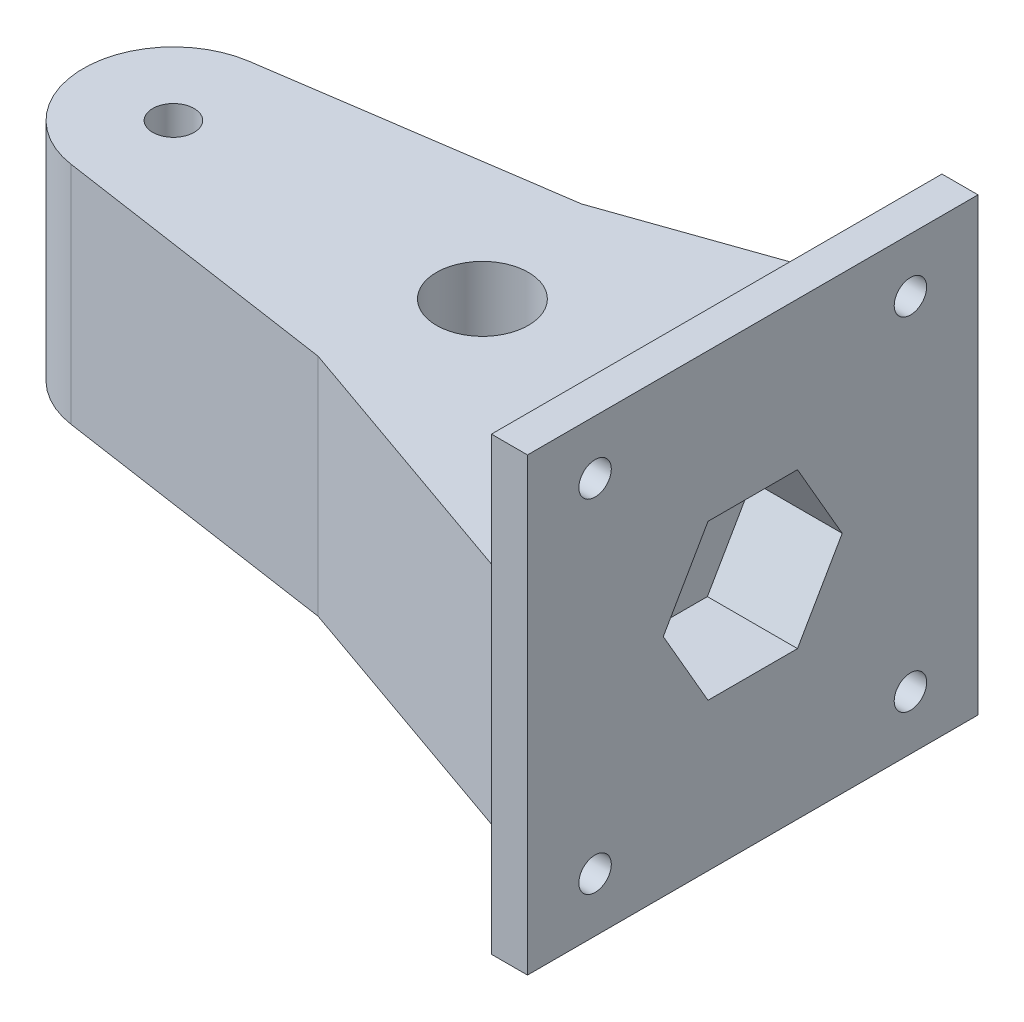
ISO-10303-21;
HEADER;
FILE_DESCRIPTION(('STEP AP214'),'2;1');
FILE_NAME('part.step','',(''),(''),'','','');
FILE_SCHEMA(('AUTOMOTIVE_DESIGN { 1 0 10303 214 1 1 1 1 }'));
ENDSEC;
DATA;
#1=APPLICATION_CONTEXT('core data for automotive mechanical design processes');
#2=APPLICATION_PROTOCOL_DEFINITION('international standard','automotive_design',2000,#1);
#3=PRODUCT_CONTEXT('',#1,'mechanical');
#4=PRODUCT('Part','Part','',(#3));
#5=PRODUCT_RELATED_PRODUCT_CATEGORY('part','',(#4));
#6=PRODUCT_DEFINITION_FORMATION('','',#4);
#7=PRODUCT_DEFINITION_CONTEXT('part definition',#1,'design');
#8=PRODUCT_DEFINITION('design','',#6,#7);
#9=PRODUCT_DEFINITION_SHAPE('','',#8);
#10=(LENGTH_UNIT() NAMED_UNIT(*) SI_UNIT(.MILLI.,.METRE.));
#11=(NAMED_UNIT(*) PLANE_ANGLE_UNIT() SI_UNIT($,.RADIAN.));
#12=(NAMED_UNIT(*) SI_UNIT($,.STERADIAN.) SOLID_ANGLE_UNIT());
#13=UNCERTAINTY_MEASURE_WITH_UNIT(LENGTH_MEASURE(1.E-05),#10,'distance_accuracy_value','');
#14=(GEOMETRIC_REPRESENTATION_CONTEXT(3) GLOBAL_UNCERTAINTY_ASSIGNED_CONTEXT((#13)) GLOBAL_UNIT_ASSIGNED_CONTEXT((#10,
#11,#12)) REPRESENTATION_CONTEXT('',''));
#15=CARTESIAN_POINT('',(0.,0.,0.));
#16=DIRECTION('',(0.,0.,1.));
#17=DIRECTION('',(1.,0.,0.));
#18=AXIS2_PLACEMENT_3D('',#15,#16,#17);
#19=CARTESIAN_POINT('',(30.,25.,-12.5));
#20=DIRECTION('',(-1.,0.,0.));
#21=DIRECTION('',(0.,0.,1.));
#22=AXIS2_PLACEMENT_3D('',#19,#20,#21);
#23=PLANE('',#22);
#24=DIRECTION('',(0.,-1.,0.));
#25=VECTOR('',#24,1.);
#26=CARTESIAN_POINT('',(30.,25.,25.));
#27=LINE('',#26,#25);
#28=CARTESIAN_POINT('',(30.,37.5,25.));
#29=VERTEX_POINT('',#28);
#30=CARTESIAN_POINT('',(30.,-12.5,25.));
#31=VERTEX_POINT('',#30);
#32=EDGE_CURVE('E147',#29,#31,#27,.T.);
#33=ORIENTED_EDGE('',*,*,#32,.T.);
#34=DIRECTION('',(0.,0.,-1.));
#35=VECTOR('',#34,1.);
#36=CARTESIAN_POINT('',(30.,-12.5,-25.));
#37=LINE('',#36,#35);
#38=CARTESIAN_POINT('',(30.,-12.5,-25.));
#39=VERTEX_POINT('',#38);
#40=EDGE_CURVE('E303',#31,#39,#37,.T.);
#41=ORIENTED_EDGE('',*,*,#40,.T.);
#42=DIRECTION('',(0.,-1.,0.));
#43=VECTOR('',#42,1.);
#44=CARTESIAN_POINT('',(30.,25.,-25.));
#45=LINE('',#44,#43);
#46=CARTESIAN_POINT('',(30.,37.5,-25.));
#47=VERTEX_POINT('',#46);
#48=EDGE_CURVE('E183',#47,#39,#45,.T.);
#49=ORIENTED_EDGE('',*,*,#48,.F.);
#50=DIRECTION('',(0.,0.,1.));
#51=VECTOR('',#50,1.);
#52=CARTESIAN_POINT('',(30.,37.5,25.));
#53=LINE('',#52,#51);
#54=EDGE_CURVE('E307',#47,#29,#53,.T.);
#55=ORIENTED_EDGE('',*,*,#54,.T.);
#56=EDGE_LOOP('',(#33,#41,#49,#55));
#57=FACE_BOUND('',#56,.T.);
#58=CARTESIAN_POINT('',(30.,31.5,17.5));
#59=DIRECTION('',(-1.,0.,0.));
#60=DIRECTION('',(0.,0.,1.));
#61=AXIS2_PLACEMENT_3D('',#58,#59,#60);
#62=CIRCLE('',#61,1.8);
#63=CARTESIAN_POINT('',(30.,31.5,19.3));
#64=VERTEX_POINT('',#63);
#65=EDGE_CURVE('E203',#64,#64,#62,.T.);
#66=ORIENTED_EDGE('',*,*,#65,.T.);
#67=EDGE_LOOP('',(#66));
#68=FACE_BOUND('',#67,.T.);
#69=CARTESIAN_POINT('',(30.,31.5,-17.5));
#70=DIRECTION('',(-1.,0.,0.));
#71=DIRECTION('',(0.,0.,1.));
#72=AXIS2_PLACEMENT_3D('',#69,#70,#71);
#73=CIRCLE('',#72,1.80000000000001);
#74=CARTESIAN_POINT('',(30.,31.5,-15.7));
#75=VERTEX_POINT('',#74);
#76=EDGE_CURVE('E208',#75,#75,#73,.T.);
#77=ORIENTED_EDGE('',*,*,#76,.T.);
#78=EDGE_LOOP('',(#77));
#79=FACE_BOUND('',#78,.T.);
#80=CARTESIAN_POINT('',(30.,-6.5,-17.5));
#81=DIRECTION('',(-1.,0.,0.));
#82=DIRECTION('',(0.,0.,1.));
#83=AXIS2_PLACEMENT_3D('',#80,#81,#82);
#84=CIRCLE('',#83,1.80000000000001);
#85=CARTESIAN_POINT('',(30.,-6.5,-15.7));
#86=VERTEX_POINT('',#85);
#87=EDGE_CURVE('E192',#86,#86,#84,.T.);
#88=ORIENTED_EDGE('',*,*,#87,.T.);
#89=EDGE_LOOP('',(#88));
#90=FACE_BOUND('',#89,.T.);
#91=CARTESIAN_POINT('',(30.,-6.5,17.5));
#92=DIRECTION('',(-1.,0.,0.));
#93=DIRECTION('',(0.,0.,1.));
#94=AXIS2_PLACEMENT_3D('',#91,#92,#93);
#95=CIRCLE('',#94,1.8);
#96=CARTESIAN_POINT('',(30.,-6.5,19.3));
#97=VERTEX_POINT('',#96);
#98=EDGE_CURVE('E198',#97,#97,#95,.T.);
#99=ORIENTED_EDGE('',*,*,#98,.T.);
#100=EDGE_LOOP('',(#99));
#101=FACE_BOUND('',#100,.T.);
#102=DIRECTION('',(0.,0.,1.));
#103=VECTOR('',#102,1.);
#104=CARTESIAN_POINT('',(30.,21.1,-12.5));
#105=LINE('',#104,#103);
#106=CARTESIAN_POINT('',(30.,21.1,-4.96521231503079));
#107=VERTEX_POINT('',#106);
#108=CARTESIAN_POINT('',(30.,21.1,4.96521231503078));
#109=VERTEX_POINT('',#108);
#110=EDGE_CURVE('E11',#107,#109,#105,.T.);
#111=ORIENTED_EDGE('',*,*,#110,.F.);
#112=DIRECTION('',(0.,0.866025403784439,0.5));
#113=VECTOR('',#112,1.);
#114=CARTESIAN_POINT('',(30.,20.7623412263473,-5.16015969889344));
#115=LINE('',#114,#113);
#116=CARTESIAN_POINT('',(30.,12.5,-9.93042463006157));
#117=VERTEX_POINT('',#116);
#118=EDGE_CURVE('E187',#117,#107,#115,.T.);
#119=ORIENTED_EDGE('',*,*,#118,.F.);
#120=DIRECTION('',(0.,0.866025403784439,-0.5));
#121=VECTOR('',#120,1.);
#122=CARTESIAN_POINT('',(30.,22.9876587736527,-15.9854772461989));
#123=LINE('',#122,#121);
#124=CARTESIAN_POINT('',(30.,3.9,-4.96521231503078));
#125=VERTEX_POINT('',#124);
#126=EDGE_CURVE('E211',#125,#117,#123,.T.);
#127=ORIENTED_EDGE('',*,*,#126,.F.);
#128=DIRECTION('',(0.,0.,-1.));
#129=VECTOR('',#128,1.);
#130=CARTESIAN_POINT('',(30.,3.9,-12.5));
#131=LINE('',#130,#129);
#132=CARTESIAN_POINT('',(30.,3.9,4.96521231503078));
#133=VERTEX_POINT('',#132);
#134=EDGE_CURVE('E214',#133,#125,#131,.T.);
#135=ORIENTED_EDGE('',*,*,#134,.F.);
#136=DIRECTION('',(0.,-0.866025403784439,-0.5));
#137=VECTOR('',#136,1.);
#138=CARTESIAN_POINT('',(30.,12.1623412263473,9.73547724619891));
#139=LINE('',#138,#137);
#140=CARTESIAN_POINT('',(30.,12.5,9.93042463006156));
#141=VERTEX_POINT('',#140);
#142=EDGE_CURVE('E218',#141,#133,#139,.T.);
#143=ORIENTED_EDGE('',*,*,#142,.F.);
#144=DIRECTION('',(0.,-0.866025403784439,0.5));
#145=VECTOR('',#144,1.);
#146=CARTESIAN_POINT('',(30.,31.5876587736527,-1.08984030110657));
#147=LINE('',#146,#145);
#148=EDGE_CURVE('E53',#109,#141,#147,.T.);
#149=ORIENTED_EDGE('',*,*,#148,.F.);
#150=EDGE_LOOP('',(#111,#119,#127,#135,#143,#149));
#151=FACE_BOUND('',#150,.T.);
#152=ADVANCED_FACE('F45',(#57,#68,#79,#90,#101,#151),#23,.F.);
#153=CARTESIAN_POINT('',(-34.3,25.,0.));
#154=DIRECTION('',(0.,1.,0.));
#155=DIRECTION('',(0.,0.,1.));
#156=AXIS2_PLACEMENT_3D('',#153,#154,#155);
#157=PLANE('',#156);
#158=CARTESIAN_POINT('',(0.,25.,0.));
#159=DIRECTION('',(0.,1.,0.));
#160=DIRECTION('',(0.,0.,1.));
#161=AXIS2_PLACEMENT_3D('',#158,#159,#160);
#162=CIRCLE('',#161,5.1);
#163=CARTESIAN_POINT('',(0.,25.,5.1));
#164=VERTEX_POINT('',#163);
#165=EDGE_CURVE('E151',#164,#164,#162,.T.);
#166=ORIENTED_EDGE('',*,*,#165,.F.);
#167=EDGE_LOOP('',(#166));
#168=FACE_BOUND('',#167,.T.);
#169=CARTESIAN_POINT('',(-34.3,25.,0.));
#170=DIRECTION('',(0.,1.,0.));
#171=DIRECTION('',(0.,0.,1.));
#172=AXIS2_PLACEMENT_3D('',#169,#170,#171);
#173=CIRCLE('',#172,2.30000000000001);
#174=CARTESIAN_POINT('',(-34.3,25.,2.30000000000001));
#175=VERTEX_POINT('',#174);
#176=EDGE_CURVE('E345',#175,#175,#173,.T.);
#177=ORIENTED_EDGE('',*,*,#176,.F.);
#178=EDGE_LOOP('',(#177));
#179=FACE_BOUND('',#178,.T.);
#180=DIRECTION('',(0.943784329190276,0.,0.33056185499065));
#181=VECTOR('',#180,1.);
#182=CARTESIAN_POINT('',(26.,25.,25.));
#183=LINE('',#182,#181);
#184=CARTESIAN_POINT('',(-3.6051533950333,25.,14.630751305289));
#185=VERTEX_POINT('',#184);
#186=CARTESIAN_POINT('',(26.,25.,25.));
#187=VERTEX_POINT('',#186);
#188=EDGE_CURVE('E141',#185,#187,#183,.T.);
#189=ORIENTED_EDGE('',*,*,#188,.T.);
#190=DIRECTION('',(0.,0.,-1.));
#191=VECTOR('',#190,1.);
#192=CARTESIAN_POINT('',(26.,25.,25.));
#193=LINE('',#192,#191);
#194=CARTESIAN_POINT('',(26.,25.,-25.));
#195=VERTEX_POINT('',#194);
#196=EDGE_CURVE('E324',#187,#195,#193,.T.);
#197=ORIENTED_EDGE('',*,*,#196,.T.);
#198=DIRECTION('',(-0.943784329190276,0.,0.33056185499065));
#199=VECTOR('',#198,1.);
#200=CARTESIAN_POINT('',(-3.60515339503332,25.,-14.630751305289));
#201=LINE('',#200,#199);
#202=CARTESIAN_POINT('',(-3.60515339503332,25.,-14.630751305289));
#203=VERTEX_POINT('',#202);
#204=EDGE_CURVE('E119',#195,#203,#201,.T.);
#205=ORIENTED_EDGE('',*,*,#204,.T.);
#206=DIRECTION('',(-0.989318124072947,0.,0.145772594752186));
#207=VECTOR('',#206,1.);
#208=CARTESIAN_POINT('',(-35.7577259475219,25.,-9.89318124072948));
#209=LINE('',#208,#207);
#210=CARTESIAN_POINT('',(-35.7577259475219,25.,-9.89318124072948));
#211=VERTEX_POINT('',#210);
#212=EDGE_CURVE('E112',#203,#211,#209,.T.);
#213=ORIENTED_EDGE('',*,*,#212,.T.);
#214=CARTESIAN_POINT('',(-34.3,25.,0.));
#215=DIRECTION('',(0.,1.,0.));
#216=DIRECTION('',(0.,0.,1.));
#217=AXIS2_PLACEMENT_3D('',#214,#215,#216);
#218=CIRCLE('',#217,10.);
#219=CARTESIAN_POINT('',(-35.7577259475219,25.,9.89318124072947));
#220=VERTEX_POINT('',#219);
#221=EDGE_CURVE('E116',#211,#220,#218,.T.);
#222=ORIENTED_EDGE('',*,*,#221,.T.);
#223=DIRECTION('',(0.989318124072947,0.,0.145772594752187));
#224=VECTOR('',#223,1.);
#225=CARTESIAN_POINT('',(-35.7577259475219,25.,9.89318124072947));
#226=LINE('',#225,#224);
#227=EDGE_CURVE('E69',#220,#185,#226,.T.);
#228=ORIENTED_EDGE('',*,*,#227,.T.);
#229=EDGE_LOOP('',(#189,#197,#205,#213,#222,#228));
#230=FACE_BOUND('',#229,.T.);
#231=ADVANCED_FACE('F114',(#168,#179,#230),#157,.T.);
#232=CARTESIAN_POINT('',(-34.3,0.,0.));
#233=DIRECTION('',(0.,1.,0.));
#234=DIRECTION('',(0.,0.,1.));
#235=AXIS2_PLACEMENT_3D('',#232,#233,#234);
#236=PLANE('',#235);
#237=DIRECTION('',(-0.943784329190276,0.,0.33056185499065));
#238=VECTOR('',#237,1.);
#239=CARTESIAN_POINT('',(-3.60515339503332,0.,-14.630751305289));
#240=LINE('',#239,#238);
#241=CARTESIAN_POINT('',(26.,0.,-25.));
#242=VERTEX_POINT('',#241);
#243=CARTESIAN_POINT('',(-3.60515339503332,0.,-14.630751305289));
#244=VERTEX_POINT('',#243);
#245=EDGE_CURVE('E148',#242,#244,#240,.T.);
#246=ORIENTED_EDGE('',*,*,#245,.F.);
#247=DIRECTION('',(0.,0.,1.));
#248=VECTOR('',#247,1.);
#249=CARTESIAN_POINT('',(26.,0.,-25.));
#250=LINE('',#249,#248);
#251=CARTESIAN_POINT('',(26.,0.,25.));
#252=VERTEX_POINT('',#251);
#253=EDGE_CURVE('E314',#242,#252,#250,.T.);
#254=ORIENTED_EDGE('',*,*,#253,.T.);
#255=DIRECTION('',(0.943784329190276,0.,0.33056185499065));
#256=VECTOR('',#255,1.);
#257=CARTESIAN_POINT('',(26.,0.,25.));
#258=LINE('',#257,#256);
#259=CARTESIAN_POINT('',(-3.6051533950333,0.,14.630751305289));
#260=VERTEX_POINT('',#259);
#261=EDGE_CURVE('E160',#260,#252,#258,.T.);
#262=ORIENTED_EDGE('',*,*,#261,.F.);
#263=DIRECTION('',(0.989318124072947,0.,0.145772594752187));
#264=VECTOR('',#263,1.);
#265=CARTESIAN_POINT('',(-35.7577259475219,0.,9.89318124072947));
#266=LINE('',#265,#264);
#267=CARTESIAN_POINT('',(-35.7577259475219,0.,9.89318124072947));
#268=VERTEX_POINT('',#267);
#269=EDGE_CURVE('E157',#268,#260,#266,.T.);
#270=ORIENTED_EDGE('',*,*,#269,.F.);
#271=CARTESIAN_POINT('',(-34.3,0.,0.));
#272=DIRECTION('',(0.,1.,0.));
#273=DIRECTION('',(0.,0.,1.));
#274=AXIS2_PLACEMENT_3D('',#271,#272,#273);
#275=CIRCLE('',#274,10.);
#276=CARTESIAN_POINT('',(-35.7577259475219,0.,-9.89318124072948));
#277=VERTEX_POINT('',#276);
#278=EDGE_CURVE('E154',#277,#268,#275,.T.);
#279=ORIENTED_EDGE('',*,*,#278,.F.);
#280=DIRECTION('',(-0.989318124072947,0.,0.145772594752186));
#281=VECTOR('',#280,1.);
#282=CARTESIAN_POINT('',(-35.7577259475219,0.,-9.89318124072948));
#283=LINE('',#282,#281);
#284=EDGE_CURVE('E129',#244,#277,#283,.T.);
#285=ORIENTED_EDGE('',*,*,#284,.F.);
#286=EDGE_LOOP('',(#246,#254,#262,#270,#279,#285));
#287=FACE_BOUND('',#286,.T.);
#288=CARTESIAN_POINT('',(0.,0.,0.));
#289=DIRECTION('',(0.,1.,0.));
#290=DIRECTION('',(0.,0.,1.));
#291=AXIS2_PLACEMENT_3D('',#288,#289,#290);
#292=CIRCLE('',#291,5.1);
#293=CARTESIAN_POINT('',(0.,0.,5.1));
#294=VERTEX_POINT('',#293);
#295=EDGE_CURVE('E349',#294,#294,#292,.T.);
#296=ORIENTED_EDGE('',*,*,#295,.T.);
#297=EDGE_LOOP('',(#296));
#298=FACE_BOUND('',#297,.T.);
#299=CARTESIAN_POINT('',(-34.3,0.,0.));
#300=DIRECTION('',(0.,1.,0.));
#301=DIRECTION('',(0.,0.,1.));
#302=AXIS2_PLACEMENT_3D('',#299,#300,#301);
#303=CIRCLE('',#302,2.30000000000001);
#304=CARTESIAN_POINT('',(-34.3,0.,2.30000000000001));
#305=VERTEX_POINT('',#304);
#306=EDGE_CURVE('E341',#305,#305,#303,.T.);
#307=ORIENTED_EDGE('',*,*,#306,.T.);
#308=EDGE_LOOP('',(#307));
#309=FACE_BOUND('',#308,.T.);
#310=ADVANCED_FACE('F361',(#287,#298,#309),#236,.F.);
#311=CARTESIAN_POINT('',(30.,25.,-25.));
#312=DIRECTION('',(0.,0.,1.));
#313=DIRECTION('',(1.,0.,0.));
#314=AXIS2_PLACEMENT_3D('',#311,#312,#313);
#315=PLANE('',#314);
#316=ORIENTED_EDGE('',*,*,#48,.T.);
#317=DIRECTION('',(1.,0.,0.));
#318=VECTOR('',#317,1.);
#319=CARTESIAN_POINT('',(26.,-12.5,-25.));
#320=LINE('',#319,#318);
#321=CARTESIAN_POINT('',(26.,-12.5,-25.));
#322=VERTEX_POINT('',#321);
#323=EDGE_CURVE('E294',#322,#39,#320,.T.);
#324=ORIENTED_EDGE('',*,*,#323,.F.);
#325=DIRECTION('',(0.,1.,0.));
#326=VECTOR('',#325,1.);
#327=CARTESIAN_POINT('',(26.,0.,-25.));
#328=LINE('',#327,#326);
#329=EDGE_CURVE('E308',#322,#242,#328,.T.);
#330=ORIENTED_EDGE('',*,*,#329,.T.);
#331=DIRECTION('',(0.,-1.,0.));
#332=VECTOR('',#331,1.);
#333=CARTESIAN_POINT('',(26.,25.,-25.));
#334=LINE('',#333,#332);
#335=EDGE_CURVE('E179',#195,#242,#334,.T.);
#336=ORIENTED_EDGE('',*,*,#335,.F.);
#337=DIRECTION('',(0.,1.,0.));
#338=VECTOR('',#337,1.);
#339=CARTESIAN_POINT('',(26.,25.,-25.));
#340=LINE('',#339,#338);
#341=CARTESIAN_POINT('',(26.,37.5,-25.));
#342=VERTEX_POINT('',#341);
#343=EDGE_CURVE('E103',#195,#342,#340,.T.);
#344=ORIENTED_EDGE('',*,*,#343,.T.);
#345=DIRECTION('',(1.,0.,0.));
#346=VECTOR('',#345,1.);
#347=CARTESIAN_POINT('',(26.,37.5,-25.));
#348=LINE('',#347,#346);
#349=EDGE_CURVE('E333',#342,#47,#348,.T.);
#350=ORIENTED_EDGE('',*,*,#349,.T.);
#351=EDGE_LOOP('',(#316,#324,#330,#336,#344,#350));
#352=FACE_BOUND('',#351,.T.);
#353=ADVANCED_FACE('F462',(#352),#315,.F.);
#354=CARTESIAN_POINT('',(-3.60515339503332,25.,-14.630751305289));
#355=DIRECTION('',(0.33056185499065,0.,0.943784329190276));
#356=DIRECTION('',(0.943784329190277,0.,-0.33056185499065));
#357=AXIS2_PLACEMENT_3D('',#354,#355,#356);
#358=PLANE('',#357);
#359=ORIENTED_EDGE('',*,*,#245,.T.);
#360=DIRECTION('',(0.,-1.,0.));
#361=VECTOR('',#360,1.);
#362=CARTESIAN_POINT('',(-3.60515339503332,25.,-14.630751305289));
#363=LINE('',#362,#361);
#364=EDGE_CURVE('E133',#203,#244,#363,.T.);
#365=ORIENTED_EDGE('',*,*,#364,.F.);
#366=ORIENTED_EDGE('',*,*,#204,.F.);
#367=ORIENTED_EDGE('',*,*,#335,.T.);
#368=EDGE_LOOP('',(#359,#365,#366,#367));
#369=FACE_BOUND('',#368,.T.);
#370=ADVANCED_FACE('F464',(#369),#358,.F.);
#371=CARTESIAN_POINT('',(-35.7577259475219,25.,-9.89318124072948));
#372=DIRECTION('',(0.145772594752186,0.,0.989318124072947));
#373=DIRECTION('',(0.989318124072947,0.,-0.145772594752186));
#374=AXIS2_PLACEMENT_3D('',#371,#372,#373);
#375=PLANE('',#374);
#376=ORIENTED_EDGE('',*,*,#284,.T.);
#377=DIRECTION('',(0.,-1.,0.));
#378=VECTOR('',#377,1.);
#379=CARTESIAN_POINT('',(-35.7577259475219,25.,-9.89318124072948));
#380=LINE('',#379,#378);
#381=EDGE_CURVE('E126',#211,#277,#380,.T.);
#382=ORIENTED_EDGE('',*,*,#381,.F.);
#383=ORIENTED_EDGE('',*,*,#212,.F.);
#384=ORIENTED_EDGE('',*,*,#364,.T.);
#385=EDGE_LOOP('',(#376,#382,#383,#384));
#386=FACE_BOUND('',#385,.T.);
#387=ADVANCED_FACE('F127',(#386),#375,.F.);
#388=CARTESIAN_POINT('',(-34.3,25.,0.));
#389=DIRECTION('',(0.,-1.,0.));
#390=DIRECTION('',(0.,0.,-1.));
#391=AXIS2_PLACEMENT_3D('',#388,#389,#390);
#392=CYLINDRICAL_SURFACE('',#391,10.);
#393=ORIENTED_EDGE('',*,*,#278,.T.);
#394=DIRECTION('',(0.,-1.,0.));
#395=VECTOR('',#394,1.);
#396=CARTESIAN_POINT('',(-35.7577259475219,25.,9.89318124072947));
#397=LINE('',#396,#395);
#398=EDGE_CURVE('E134',#220,#268,#397,.T.);
#399=ORIENTED_EDGE('',*,*,#398,.F.);
#400=ORIENTED_EDGE('',*,*,#221,.F.);
#401=ORIENTED_EDGE('',*,*,#381,.T.);
#402=EDGE_LOOP('',(#393,#399,#400,#401));
#403=FACE_BOUND('',#402,.T.);
#404=ADVANCED_FACE('F136',(#403),#392,.T.);
#405=CARTESIAN_POINT('',(-35.7577259475219,25.,9.89318124072947));
#406=DIRECTION('',(0.145772594752187,0.,-0.989318124072947));
#407=DIRECTION('',(-0.989318124072947,0.,-0.145772594752187));
#408=AXIS2_PLACEMENT_3D('',#405,#406,#407);
#409=PLANE('',#408);
#410=ORIENTED_EDGE('',*,*,#269,.T.);
#411=DIRECTION('',(0.,-1.,0.));
#412=VECTOR('',#411,1.);
#413=CARTESIAN_POINT('',(-3.6051533950333,25.,14.630751305289));
#414=LINE('',#413,#412);
#415=EDGE_CURVE('E171',#185,#260,#414,.T.);
#416=ORIENTED_EDGE('',*,*,#415,.F.);
#417=ORIENTED_EDGE('',*,*,#227,.F.);
#418=ORIENTED_EDGE('',*,*,#398,.T.);
#419=EDGE_LOOP('',(#410,#416,#417,#418));
#420=FACE_BOUND('',#419,.T.);
#421=ADVANCED_FACE('F466',(#420),#409,.F.);
#422=CARTESIAN_POINT('',(26.,25.,25.));
#423=DIRECTION('',(0.33056185499065,0.,-0.943784329190276));
#424=DIRECTION('',(-0.943784329190277,0.,-0.330561854990651));
#425=AXIS2_PLACEMENT_3D('',#422,#423,#424);
#426=PLANE('',#425);
#427=ORIENTED_EDGE('',*,*,#261,.T.);
#428=DIRECTION('',(0.,-1.,0.));
#429=VECTOR('',#428,1.);
#430=CARTESIAN_POINT('',(26.,25.,25.));
#431=LINE('',#430,#429);
#432=EDGE_CURVE('E167',#187,#252,#431,.T.);
#433=ORIENTED_EDGE('',*,*,#432,.F.);
#434=ORIENTED_EDGE('',*,*,#188,.F.);
#435=ORIENTED_EDGE('',*,*,#415,.T.);
#436=EDGE_LOOP('',(#427,#433,#434,#435));
#437=FACE_BOUND('',#436,.T.);
#438=ADVANCED_FACE('F378',(#437),#426,.F.);
#439=CARTESIAN_POINT('',(26.,25.,25.));
#440=DIRECTION('',(0.,0.,-1.));
#441=DIRECTION('',(-1.,0.,0.));
#442=AXIS2_PLACEMENT_3D('',#439,#440,#441);
#443=PLANE('',#442);
#444=ORIENTED_EDGE('',*,*,#432,.T.);
#445=DIRECTION('',(0.,-1.,0.));
#446=VECTOR('',#445,1.);
#447=CARTESIAN_POINT('',(26.,0.,25.));
#448=LINE('',#447,#446);
#449=CARTESIAN_POINT('',(26.,-12.5,25.));
#450=VERTEX_POINT('',#449);
#451=EDGE_CURVE('E94',#252,#450,#448,.T.);
#452=ORIENTED_EDGE('',*,*,#451,.T.);
#453=DIRECTION('',(1.,0.,0.));
#454=VECTOR('',#453,1.);
#455=CARTESIAN_POINT('',(26.,-12.5,25.));
#456=LINE('',#455,#454);
#457=EDGE_CURVE('E295',#450,#31,#456,.T.);
#458=ORIENTED_EDGE('',*,*,#457,.T.);
#459=ORIENTED_EDGE('',*,*,#32,.F.);
#460=DIRECTION('',(1.,0.,0.));
#461=VECTOR('',#460,1.);
#462=CARTESIAN_POINT('',(26.,37.5,25.));
#463=LINE('',#462,#461);
#464=CARTESIAN_POINT('',(26.,37.5,25.));
#465=VERTEX_POINT('',#464);
#466=EDGE_CURVE('E337',#465,#29,#463,.T.);
#467=ORIENTED_EDGE('',*,*,#466,.F.);
#468=DIRECTION('',(0.,-1.,0.));
#469=VECTOR('',#468,1.);
#470=CARTESIAN_POINT('',(26.,25.,25.));
#471=LINE('',#470,#469);
#472=EDGE_CURVE('E320',#465,#187,#471,.T.);
#473=ORIENTED_EDGE('',*,*,#472,.T.);
#474=EDGE_LOOP('',(#444,#452,#458,#459,#467,#473));
#475=FACE_BOUND('',#474,.T.);
#476=ADVANCED_FACE('F367',(#475),#443,.F.);
#477=CARTESIAN_POINT('',(0.,25.,0.));
#478=DIRECTION('',(0.,-1.,0.));
#479=DIRECTION('',(0.,0.,-1.));
#480=AXIS2_PLACEMENT_3D('',#477,#478,#479);
#481=CYLINDRICAL_SURFACE('',#480,5.1);
#482=ORIENTED_EDGE('',*,*,#165,.T.);
#483=EDGE_LOOP('',(#482));
#484=FACE_BOUND('',#483,.T.);
#485=ORIENTED_EDGE('',*,*,#295,.F.);
#486=EDGE_LOOP('',(#485));
#487=FACE_BOUND('',#486,.T.);
#488=ADVANCED_FACE('F364',(#484,#487),#481,.F.);
#489=CARTESIAN_POINT('',(-34.3,25.,0.));
#490=DIRECTION('',(0.,-1.,0.));
#491=DIRECTION('',(0.,0.,-1.));
#492=AXIS2_PLACEMENT_3D('',#489,#490,#491);
#493=CYLINDRICAL_SURFACE('',#492,2.30000000000001);
#494=ORIENTED_EDGE('',*,*,#176,.T.);
#495=EDGE_LOOP('',(#494));
#496=FACE_BOUND('',#495,.T.);
#497=ORIENTED_EDGE('',*,*,#306,.F.);
#498=EDGE_LOOP('',(#497));
#499=FACE_BOUND('',#498,.T.);
#500=ADVANCED_FACE('F366',(#496,#499),#493,.F.);
#501=CARTESIAN_POINT('',(26.,37.5,25.));
#502=DIRECTION('',(0.,1.,0.));
#503=DIRECTION('',(0.,0.,1.));
#504=AXIS2_PLACEMENT_3D('',#501,#502,#503);
#505=PLANE('',#504);
#506=ORIENTED_EDGE('',*,*,#54,.F.);
#507=ORIENTED_EDGE('',*,*,#349,.F.);
#508=DIRECTION('',(0.,0.,1.));
#509=VECTOR('',#508,1.);
#510=CARTESIAN_POINT('',(26.,37.5,25.));
#511=LINE('',#510,#509);
#512=EDGE_CURVE('E329',#342,#465,#511,.T.);
#513=ORIENTED_EDGE('',*,*,#512,.T.);
#514=ORIENTED_EDGE('',*,*,#466,.T.);
#515=EDGE_LOOP('',(#506,#507,#513,#514));
#516=FACE_BOUND('',#515,.T.);
#517=ADVANCED_FACE('F374',(#516),#505,.T.);
#518=CARTESIAN_POINT('',(26.,0.,0.));
#519=DIRECTION('',(-1.,0.,0.));
#520=DIRECTION('',(0.,0.,1.));
#521=AXIS2_PLACEMENT_3D('',#518,#519,#520);
#522=PLANE('',#521);
#523=CARTESIAN_POINT('',(26.,31.5,-17.5));
#524=DIRECTION('',(-1.,0.,0.));
#525=DIRECTION('',(0.,0.,1.));
#526=AXIS2_PLACEMENT_3D('',#523,#524,#525);
#527=CIRCLE('',#526,1.80000000000001);
#528=CARTESIAN_POINT('',(26.,31.5,-15.7));
#529=VERTEX_POINT('',#528);
#530=EDGE_CURVE('E204',#529,#529,#527,.T.);
#531=ORIENTED_EDGE('',*,*,#530,.F.);
#532=EDGE_LOOP('',(#531));
#533=FACE_BOUND('',#532,.T.);
#534=CARTESIAN_POINT('',(26.,31.5,17.5));
#535=DIRECTION('',(-1.,0.,0.));
#536=DIRECTION('',(0.,0.,1.));
#537=AXIS2_PLACEMENT_3D('',#534,#535,#536);
#538=CIRCLE('',#537,1.8);
#539=CARTESIAN_POINT('',(26.,31.5,19.3));
#540=VERTEX_POINT('',#539);
#541=EDGE_CURVE('E199',#540,#540,#538,.T.);
#542=ORIENTED_EDGE('',*,*,#541,.F.);
#543=EDGE_LOOP('',(#542));
#544=FACE_BOUND('',#543,.T.);
#545=ORIENTED_EDGE('',*,*,#472,.F.);
#546=ORIENTED_EDGE('',*,*,#512,.F.);
#547=ORIENTED_EDGE('',*,*,#343,.F.);
#548=ORIENTED_EDGE('',*,*,#196,.F.);
#549=EDGE_LOOP('',(#545,#546,#547,#548));
#550=FACE_BOUND('',#549,.T.);
#551=ADVANCED_FACE('F422',(#533,#544,#550),#522,.T.);
#552=CARTESIAN_POINT('',(26.,-12.5,-25.));
#553=DIRECTION('',(0.,-1.,0.));
#554=DIRECTION('',(0.,0.,-1.));
#555=AXIS2_PLACEMENT_3D('',#552,#553,#554);
#556=PLANE('',#555);
#557=ORIENTED_EDGE('',*,*,#40,.F.);
#558=ORIENTED_EDGE('',*,*,#457,.F.);
#559=DIRECTION('',(0.,0.,-1.));
#560=VECTOR('',#559,1.);
#561=CARTESIAN_POINT('',(26.,-12.5,-25.));
#562=LINE('',#561,#560);
#563=EDGE_CURVE('E299',#450,#322,#562,.T.);
#564=ORIENTED_EDGE('',*,*,#563,.T.);
#565=ORIENTED_EDGE('',*,*,#323,.T.);
#566=EDGE_LOOP('',(#557,#558,#564,#565));
#567=FACE_BOUND('',#566,.T.);
#568=ADVANCED_FACE('F419',(#567),#556,.T.);
#569=CARTESIAN_POINT('',(26.,0.,0.));
#570=DIRECTION('',(-1.,0.,0.));
#571=DIRECTION('',(0.,0.,1.));
#572=AXIS2_PLACEMENT_3D('',#569,#570,#571);
#573=PLANE('',#572);
#574=CARTESIAN_POINT('',(26.,-6.5,17.5));
#575=DIRECTION('',(-1.,0.,0.));
#576=DIRECTION('',(0.,0.,1.));
#577=AXIS2_PLACEMENT_3D('',#574,#575,#576);
#578=CIRCLE('',#577,1.8);
#579=CARTESIAN_POINT('',(26.,-6.5,19.3));
#580=VERTEX_POINT('',#579);
#581=EDGE_CURVE('E194',#580,#580,#578,.T.);
#582=ORIENTED_EDGE('',*,*,#581,.F.);
#583=EDGE_LOOP('',(#582));
#584=FACE_BOUND('',#583,.T.);
#585=CARTESIAN_POINT('',(26.,-6.5,-17.5));
#586=DIRECTION('',(-1.,0.,0.));
#587=DIRECTION('',(0.,0.,1.));
#588=AXIS2_PLACEMENT_3D('',#585,#586,#587);
#589=CIRCLE('',#588,1.80000000000001);
#590=CARTESIAN_POINT('',(26.,-6.5,-15.7));
#591=VERTEX_POINT('',#590);
#592=EDGE_CURVE('E188',#591,#591,#589,.T.);
#593=ORIENTED_EDGE('',*,*,#592,.F.);
#594=EDGE_LOOP('',(#593));
#595=FACE_BOUND('',#594,.T.);
#596=ORIENTED_EDGE('',*,*,#329,.F.);
#597=ORIENTED_EDGE('',*,*,#563,.F.);
#598=ORIENTED_EDGE('',*,*,#451,.F.);
#599=ORIENTED_EDGE('',*,*,#253,.F.);
#600=EDGE_LOOP('',(#596,#597,#598,#599));
#601=FACE_BOUND('',#600,.T.);
#602=ADVANCED_FACE('F414',(#584,#595,#601),#573,.T.);
#603=CARTESIAN_POINT('',(-44.3,-6.5,-17.5));
#604=DIRECTION('',(1.,0.,0.));
#605=DIRECTION('',(0.,0.,-1.));
#606=AXIS2_PLACEMENT_3D('',#603,#604,#605);
#607=CYLINDRICAL_SURFACE('',#606,1.80000000000001);
#608=ORIENTED_EDGE('',*,*,#592,.T.);
#609=EDGE_LOOP('',(#608));
#610=FACE_BOUND('',#609,.T.);
#611=ORIENTED_EDGE('',*,*,#87,.F.);
#612=EDGE_LOOP('',(#611));
#613=FACE_BOUND('',#612,.T.);
#614=ADVANCED_FACE('F404',(#610,#613),#607,.F.);
#615=CARTESIAN_POINT('',(-44.3,-6.5,17.5));
#616=DIRECTION('',(1.,0.,0.));
#617=DIRECTION('',(0.,0.,-1.));
#618=AXIS2_PLACEMENT_3D('',#615,#616,#617);
#619=CYLINDRICAL_SURFACE('',#618,1.8);
#620=ORIENTED_EDGE('',*,*,#581,.T.);
#621=EDGE_LOOP('',(#620));
#622=FACE_BOUND('',#621,.T.);
#623=ORIENTED_EDGE('',*,*,#98,.F.);
#624=EDGE_LOOP('',(#623));
#625=FACE_BOUND('',#624,.T.);
#626=ADVANCED_FACE('F401',(#622,#625),#619,.F.);
#627=CARTESIAN_POINT('',(-44.3,31.5,17.5));
#628=DIRECTION('',(1.,0.,0.));
#629=DIRECTION('',(0.,0.,-1.));
#630=AXIS2_PLACEMENT_3D('',#627,#628,#629);
#631=CYLINDRICAL_SURFACE('',#630,1.8);
#632=ORIENTED_EDGE('',*,*,#541,.T.);
#633=EDGE_LOOP('',(#632));
#634=FACE_BOUND('',#633,.T.);
#635=ORIENTED_EDGE('',*,*,#65,.F.);
#636=EDGE_LOOP('',(#635));
#637=FACE_BOUND('',#636,.T.);
#638=ADVANCED_FACE('F403',(#634,#637),#631,.F.);
#639=CARTESIAN_POINT('',(-44.3,31.5,-17.5));
#640=DIRECTION('',(1.,0.,0.));
#641=DIRECTION('',(0.,0.,-1.));
#642=AXIS2_PLACEMENT_3D('',#639,#640,#641);
#643=CYLINDRICAL_SURFACE('',#642,1.80000000000001);
#644=ORIENTED_EDGE('',*,*,#530,.T.);
#645=EDGE_LOOP('',(#644));
#646=FACE_BOUND('',#645,.T.);
#647=ORIENTED_EDGE('',*,*,#76,.F.);
#648=EDGE_LOOP('',(#647));
#649=FACE_BOUND('',#648,.T.);
#650=ADVANCED_FACE('F411',(#646,#649),#643,.F.);
#651=CARTESIAN_POINT('',(30.000012,21.1,-4.96521231503079));
#652=DIRECTION('',(0.,-1.,0.));
#653=DIRECTION('',(0.,0.,-1.));
#654=AXIS2_PLACEMENT_3D('',#651,#652,#653);
#655=PLANE('',#654);
#656=ORIENTED_EDGE('',*,*,#110,.T.);
#657=DIRECTION('',(-1.,0.,0.));
#658=VECTOR('',#657,1.);
#659=CARTESIAN_POINT('',(30.000012,21.1,4.96521231503078));
#660=LINE('',#659,#658);
#661=CARTESIAN_POINT('',(20.,21.1,4.96521231503078));
#662=VERTEX_POINT('',#661);
#663=EDGE_CURVE('E193',#109,#662,#660,.T.);
#664=ORIENTED_EDGE('',*,*,#663,.T.);
#665=DIRECTION('',(0.,0.,1.));
#666=VECTOR('',#665,1.);
#667=CARTESIAN_POINT('',(20.,21.1,-4.96521231503079));
#668=LINE('',#667,#666);
#669=CARTESIAN_POINT('',(20.,21.1,-4.96521231503079));
#670=VERTEX_POINT('',#669);
#671=EDGE_CURVE('E650',#670,#662,#668,.T.);
#672=ORIENTED_EDGE('',*,*,#671,.F.);
#673=DIRECTION('',(-1.,0.,0.));
#674=VECTOR('',#673,1.);
#675=CARTESIAN_POINT('',(30.000012,21.1,-4.96521231503079));
#676=LINE('',#675,#674);
#677=EDGE_CURVE('E276',#107,#670,#676,.T.);
#678=ORIENTED_EDGE('',*,*,#677,.F.);
#679=EDGE_LOOP('',(#656,#664,#672,#678));
#680=FACE_BOUND('',#679,.T.);
#681=ADVANCED_FACE('F568',(#680),#655,.T.);
#682=CARTESIAN_POINT('',(30.000012,21.1,4.96521231503078));
#683=DIRECTION('',(0.,-0.5,-0.866025403784439));
#684=DIRECTION('',(0.,0.866025403784439,-0.5));
#685=AXIS2_PLACEMENT_3D('',#682,#683,#684);
#686=PLANE('',#685);
#687=ORIENTED_EDGE('',*,*,#148,.T.);
#688=DIRECTION('',(-1.,0.,0.));
#689=VECTOR('',#688,1.);
#690=CARTESIAN_POINT('',(30.000012,12.5,9.93042463006156));
#691=LINE('',#690,#689);
#692=CARTESIAN_POINT('',(20.,12.5,9.93042463006156));
#693=VERTEX_POINT('',#692);
#694=EDGE_CURVE('E232',#141,#693,#691,.T.);
#695=ORIENTED_EDGE('',*,*,#694,.T.);
#696=DIRECTION('',(0.,-0.866025403784439,0.5));
#697=VECTOR('',#696,1.);
#698=CARTESIAN_POINT('',(20.,21.1,4.96521231503078));
#699=LINE('',#698,#697);
#700=EDGE_CURVE('E651',#662,#693,#699,.T.);
#701=ORIENTED_EDGE('',*,*,#700,.F.);
#702=ORIENTED_EDGE('',*,*,#663,.F.);
#703=EDGE_LOOP('',(#687,#695,#701,#702));
#704=FACE_BOUND('',#703,.T.);
#705=ADVANCED_FACE('F229',(#704),#686,.T.);
#706=CARTESIAN_POINT('',(30.000012,12.5,9.93042463006156));
#707=DIRECTION('',(0.,0.5,-0.866025403784439));
#708=DIRECTION('',(0.,0.866025403784439,0.5));
#709=AXIS2_PLACEMENT_3D('',#706,#707,#708);
#710=PLANE('',#709);
#711=ORIENTED_EDGE('',*,*,#142,.T.);
#712=DIRECTION('',(-1.,0.,0.));
#713=VECTOR('',#712,1.);
#714=CARTESIAN_POINT('',(30.000012,3.9,4.96521231503078));
#715=LINE('',#714,#713);
#716=CARTESIAN_POINT('',(20.,3.9,4.96521231503078));
#717=VERTEX_POINT('',#716);
#718=EDGE_CURVE('E249',#133,#717,#715,.T.);
#719=ORIENTED_EDGE('',*,*,#718,.T.);
#720=DIRECTION('',(0.,-0.866025403784439,-0.5));
#721=VECTOR('',#720,1.);
#722=CARTESIAN_POINT('',(20.,12.5,9.93042463006156));
#723=LINE('',#722,#721);
#724=EDGE_CURVE('E246',#693,#717,#723,.T.);
#725=ORIENTED_EDGE('',*,*,#724,.F.);
#726=ORIENTED_EDGE('',*,*,#694,.F.);
#727=EDGE_LOOP('',(#711,#719,#725,#726));
#728=FACE_BOUND('',#727,.T.);
#729=ADVANCED_FACE('F242',(#728),#710,.T.);
#730=CARTESIAN_POINT('',(30.000012,3.9,4.96521231503078));
#731=DIRECTION('',(0.,1.,0.));
#732=DIRECTION('',(0.,0.,1.));
#733=AXIS2_PLACEMENT_3D('',#730,#731,#732);
#734=PLANE('',#733);
#735=ORIENTED_EDGE('',*,*,#134,.T.);
#736=DIRECTION('',(-1.,0.,0.));
#737=VECTOR('',#736,1.);
#738=CARTESIAN_POINT('',(30.000012,3.9,-4.96521231503078));
#739=LINE('',#738,#737);
#740=CARTESIAN_POINT('',(20.,3.9,-4.96521231503078));
#741=VERTEX_POINT('',#740);
#742=EDGE_CURVE('E262',#125,#741,#739,.T.);
#743=ORIENTED_EDGE('',*,*,#742,.T.);
#744=DIRECTION('',(0.,0.,-1.));
#745=VECTOR('',#744,1.);
#746=CARTESIAN_POINT('',(20.,3.9,4.96521231503078));
#747=LINE('',#746,#745);
#748=EDGE_CURVE('E663',#717,#741,#747,.T.);
#749=ORIENTED_EDGE('',*,*,#748,.F.);
#750=ORIENTED_EDGE('',*,*,#718,.F.);
#751=EDGE_LOOP('',(#735,#743,#749,#750));
#752=FACE_BOUND('',#751,.T.);
#753=ADVANCED_FACE('F259',(#752),#734,.T.);
#754=CARTESIAN_POINT('',(30.000012,3.9,-4.96521231503078));
#755=DIRECTION('',(0.,0.5,0.866025403784439));
#756=DIRECTION('',(0.,-0.866025403784439,0.5));
#757=AXIS2_PLACEMENT_3D('',#754,#755,#756);
#758=PLANE('',#757);
#759=ORIENTED_EDGE('',*,*,#126,.T.);
#760=DIRECTION('',(-1.,0.,0.));
#761=VECTOR('',#760,1.);
#762=CARTESIAN_POINT('',(30.000012,12.5,-9.93042463006157));
#763=LINE('',#762,#761);
#764=CARTESIAN_POINT('',(20.,12.5,-9.93042463006157));
#765=VERTEX_POINT('',#764);
#766=EDGE_CURVE('E60',#117,#765,#763,.T.);
#767=ORIENTED_EDGE('',*,*,#766,.T.);
#768=DIRECTION('',(0.,0.866025403784439,-0.5));
#769=VECTOR('',#768,1.);
#770=CARTESIAN_POINT('',(20.,3.9,-4.96521231503078));
#771=LINE('',#770,#769);
#772=EDGE_CURVE('E269',#741,#765,#771,.T.);
#773=ORIENTED_EDGE('',*,*,#772,.F.);
#774=ORIENTED_EDGE('',*,*,#742,.F.);
#775=EDGE_LOOP('',(#759,#767,#773,#774));
#776=FACE_BOUND('',#775,.T.);
#777=ADVANCED_FACE('F267',(#776),#758,.T.);
#778=CARTESIAN_POINT('',(30.000012,12.5,-9.93042463006157));
#779=DIRECTION('',(0.,-0.5,0.866025403784439));
#780=DIRECTION('',(0.,-0.866025403784439,-0.5));
#781=AXIS2_PLACEMENT_3D('',#778,#779,#780);
#782=PLANE('',#781);
#783=ORIENTED_EDGE('',*,*,#118,.T.);
#784=ORIENTED_EDGE('',*,*,#677,.T.);
#785=DIRECTION('',(0.,0.866025403784439,0.5));
#786=VECTOR('',#785,1.);
#787=CARTESIAN_POINT('',(20.,12.5,-9.93042463006157));
#788=LINE('',#787,#786);
#789=EDGE_CURVE('E653',#765,#670,#788,.T.);
#790=ORIENTED_EDGE('',*,*,#789,.F.);
#791=ORIENTED_EDGE('',*,*,#766,.F.);
#792=EDGE_LOOP('',(#783,#784,#790,#791));
#793=FACE_BOUND('',#792,.T.);
#794=ADVANCED_FACE('F625',(#793),#782,.T.);
#795=CARTESIAN_POINT('',(20.,0.,0.));
#796=DIRECTION('',(1.,0.,0.));
#797=DIRECTION('',(0.,0.,-1.));
#798=AXIS2_PLACEMENT_3D('',#795,#796,#797);
#799=PLANE('',#798);
#800=ORIENTED_EDGE('',*,*,#671,.T.);
#801=ORIENTED_EDGE('',*,*,#700,.T.);
#802=ORIENTED_EDGE('',*,*,#724,.T.);
#803=ORIENTED_EDGE('',*,*,#748,.T.);
#804=ORIENTED_EDGE('',*,*,#772,.T.);
#805=ORIENTED_EDGE('',*,*,#789,.T.);
#806=EDGE_LOOP('',(#800,#801,#802,#803,#804,#805));
#807=FACE_BOUND('',#806,.T.);
#808=ADVANCED_FACE('F634',(#807),#799,.T.);
#809=CLOSED_SHELL('',(#152,#231,#310,#353,#370,#387,#404,#421,#438,#476,#488,#500,#517,#551,
#568,#602,#614,#626,#638,#650,#681,#705,#729,#753,#777,#794,#808));
#810=MANIFOLD_SOLID_BREP('B2',#809);
#811=ADVANCED_BREP_SHAPE_REPRESENTATION('',(#18,#810),#14);
#812=SHAPE_DEFINITION_REPRESENTATION(#9,#811);
ENDSEC;
END-ISO-10303-21;
